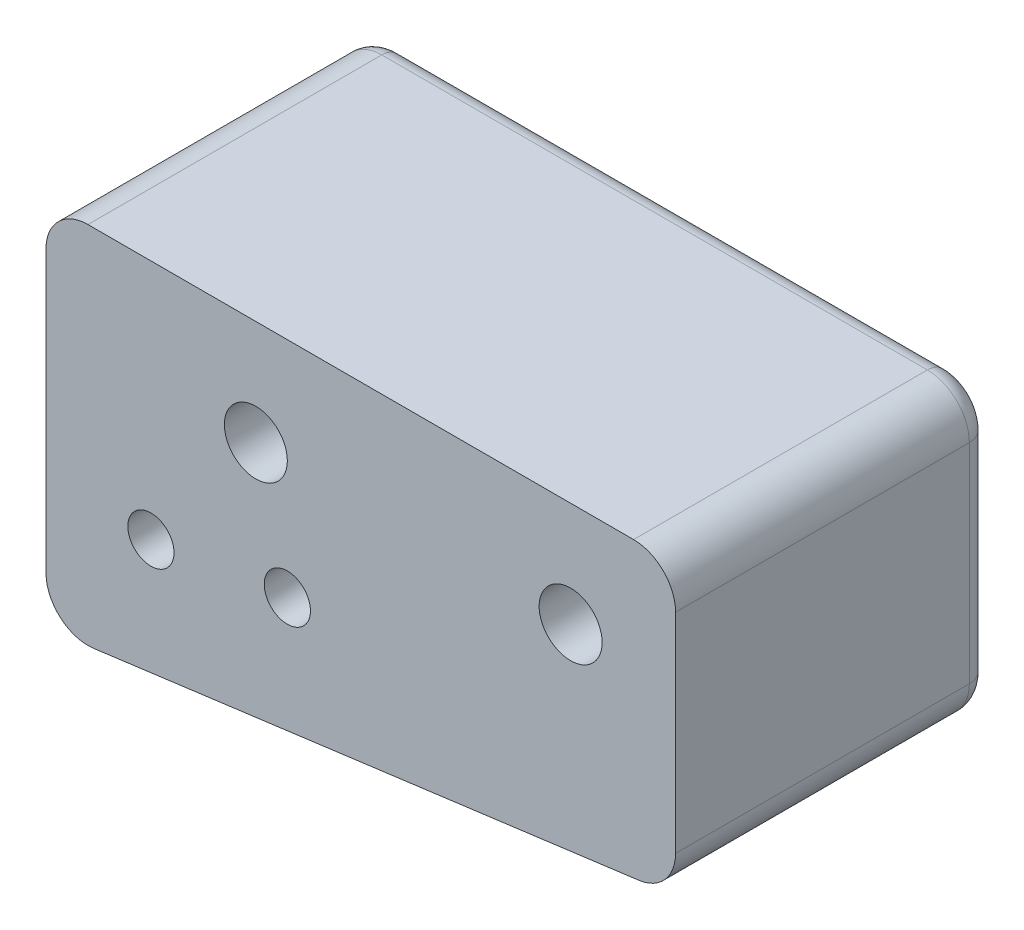
ISO-10303-21;
HEADER;
FILE_DESCRIPTION(('STEP AP214'),'2;1');
FILE_NAME('part.step','',(''),(''),'','','');
FILE_SCHEMA(('AUTOMOTIVE_DESIGN { 1 0 10303 214 1 1 1 1 }'));
ENDSEC;
DATA;
#1=APPLICATION_CONTEXT('core data for automotive mechanical design processes');
#2=APPLICATION_PROTOCOL_DEFINITION('international standard','automotive_design',2000,#1);
#3=PRODUCT_CONTEXT('',#1,'mechanical');
#4=PRODUCT('Part','Part','',(#3));
#5=PRODUCT_RELATED_PRODUCT_CATEGORY('part','',(#4));
#6=PRODUCT_DEFINITION_FORMATION('','',#4);
#7=PRODUCT_DEFINITION_CONTEXT('part definition',#1,'design');
#8=PRODUCT_DEFINITION('design','',#6,#7);
#9=PRODUCT_DEFINITION_SHAPE('','',#8);
#10=(LENGTH_UNIT() NAMED_UNIT(*) SI_UNIT(.MILLI.,.METRE.));
#11=(NAMED_UNIT(*) PLANE_ANGLE_UNIT() SI_UNIT($,.RADIAN.));
#12=(NAMED_UNIT(*) SI_UNIT($,.STERADIAN.) SOLID_ANGLE_UNIT());
#13=UNCERTAINTY_MEASURE_WITH_UNIT(LENGTH_MEASURE(1.E-05),#10,'distance_accuracy_value','');
#14=(GEOMETRIC_REPRESENTATION_CONTEXT(3) GLOBAL_UNCERTAINTY_ASSIGNED_CONTEXT((#13)) GLOBAL_UNIT_ASSIGNED_CONTEXT((#10,
#11,#12)) REPRESENTATION_CONTEXT('',''));
#15=CARTESIAN_POINT('',(0.,0.,0.));
#16=DIRECTION('',(0.,0.,1.));
#17=DIRECTION('',(1.,0.,0.));
#18=AXIS2_PLACEMENT_3D('',#15,#16,#17);
#19=CARTESIAN_POINT('',(0.,0.,-15.));
#20=DIRECTION('',(0.,0.,1.));
#21=DIRECTION('',(-1.,0.,0.));
#22=AXIS2_PLACEMENT_3D('',#19,#20,#21);
#23=PLANE('',#22);
#24=DIRECTION('',(0.,-1.,0.));
#25=VECTOR('',#24,1.);
#26=CARTESIAN_POINT('',(1.,0.,-15.));
#27=LINE('',#26,#25);
#28=CARTESIAN_POINT('',(0.999999999999999,0.919280300178109,-15.));
#29=VERTEX_POINT('',#28);
#30=CARTESIAN_POINT('',(1.,-5.37390181447922,-15.));
#31=VERTEX_POINT('',#30);
#32=EDGE_CURVE('E306',#29,#31,#27,.T.);
#33=ORIENTED_EDGE('',*,*,#32,.F.);
#34=DIRECTION('',(0.130526192220053,-0.99144486137381,0.));
#35=VECTOR('',#34,1.);
#36=CARTESIAN_POINT('',(1.96307764153026,-6.39602065634889,-15.));
#37=LINE('',#36,#35);
#38=CARTESIAN_POINT('',(1.96006059571014,-6.37310391815243,-15.));
#39=VERTEX_POINT('',#38);
#40=EDGE_CURVE('E441',#29,#39,#37,.T.);
#41=ORIENTED_EDGE('',*,*,#40,.T.);
#42=CARTESIAN_POINT('',(2.,-5.37390181447922,-15.));
#43=DIRECTION('',(0.,0.,-1.));
#44=DIRECTION('',(-1.,0.,0.));
#45=AXIS2_PLACEMENT_3D('',#42,#43,#44);
#46=CIRCLE('',#45,1.);
#47=EDGE_CURVE('E309',#31,#39,#46,.F.);
#48=ORIENTED_EDGE('',*,*,#47,.F.);
#49=EDGE_LOOP('',(#33,#41,#48));
#50=FACE_BOUND('',#49,.T.);
#51=ADVANCED_FACE('F43',(#50),#23,.F.);
#52=DIRECTION('',(-0.130526192220053,0.99144486137381,0.));
#53=VECTOR('',#52,1.);
#54=CARTESIAN_POINT('',(14.541060574064,3.79062029652878,-15.));
#55=LINE('',#54,#53);
#56=CARTESIAN_POINT('',(15.6439000588201,-4.58627725548289,-15.));
#57=VERTEX_POINT('',#56);
#58=CARTESIAN_POINT('',(14.541060574064,3.79062029652878,-15.));
#59=VERTEX_POINT('',#58);
#60=EDGE_CURVE('E195',#57,#59,#55,.T.);
#61=ORIENTED_EDGE('',*,*,#60,.T.);
#62=DIRECTION('',(-0.99144486137381,-0.130526192220053,0.));
#63=VECTOR('',#62,1.);
#64=CARTESIAN_POINT('',(0.859121487105373,1.98935884389205,-15.));
#65=LINE('',#64,#63);
#66=CARTESIAN_POINT('',(1.,2.00790585197102,-15.));
#67=VERTEX_POINT('',#66);
#68=EDGE_CURVE('E445',#59,#67,#65,.T.);
#69=ORIENTED_EDGE('',*,*,#68,.T.);
#70=DIRECTION('',(0.,-1.,0.));
#71=VECTOR('',#70,1.);
#72=CARTESIAN_POINT('',(1.,0.,-15.));
#73=LINE('',#72,#71);
#74=CARTESIAN_POINT('',(1.,8.,-15.));
#75=VERTEX_POINT('',#74);
#76=EDGE_CURVE('E291',#75,#67,#73,.T.);
#77=ORIENTED_EDGE('',*,*,#76,.F.);
#78=CARTESIAN_POINT('',(2.,8.,-15.));
#79=DIRECTION('',(0.,0.,-1.));
#80=DIRECTION('',(-1.,0.,0.));
#81=AXIS2_PLACEMENT_3D('',#78,#79,#80);
#82=CIRCLE('',#81,1.);
#83=CARTESIAN_POINT('',(2.,9.,-15.));
#84=VERTEX_POINT('',#83);
#85=EDGE_CURVE('E289',#84,#75,#82,.F.);
#86=ORIENTED_EDGE('',*,*,#85,.F.);
#87=DIRECTION('',(-1.,0.,0.));
#88=VECTOR('',#87,1.);
#89=CARTESIAN_POINT('',(0.,9.,-15.));
#90=LINE('',#89,#88);
#91=CARTESIAN_POINT('',(28.,9.,-15.));
#92=VERTEX_POINT('',#91);
#93=EDGE_CURVE('E287',#92,#84,#90,.T.);
#94=ORIENTED_EDGE('',*,*,#93,.F.);
#95=CARTESIAN_POINT('',(28.,8.,-15.));
#96=DIRECTION('',(0.,0.,-1.));
#97=DIRECTION('',(-1.,0.,0.));
#98=AXIS2_PLACEMENT_3D('',#95,#96,#97);
#99=CIRCLE('',#98,1.);
#100=CARTESIAN_POINT('',(29.,8.,-15.));
#101=VERTEX_POINT('',#100);
#102=EDGE_CURVE('E294',#101,#92,#99,.F.);
#103=ORIENTED_EDGE('',*,*,#102,.F.);
#104=DIRECTION('',(0.,1.,0.));
#105=VECTOR('',#104,1.);
#106=CARTESIAN_POINT('',(29.,0.,-15.));
#107=LINE('',#106,#105);
#108=CARTESIAN_POINT('',(29.,-1.9509368772069,-15.));
#109=VERTEX_POINT('',#108);
#110=EDGE_CURVE('E297',#109,#101,#107,.T.);
#111=ORIENTED_EDGE('',*,*,#110,.F.);
#112=CARTESIAN_POINT('',(28.,-1.9509368772069,-15.));
#113=DIRECTION('',(0.,0.,-1.));
#114=DIRECTION('',(-1.,0.,0.));
#115=AXIS2_PLACEMENT_3D('',#112,#113,#114);
#116=CIRCLE('',#115,1.);
#117=CARTESIAN_POINT('',(28.1305261922201,-2.94238173858071,-15.));
#118=VERTEX_POINT('',#117);
#119=EDGE_CURVE('E300',#118,#109,#116,.F.);
#120=ORIENTED_EDGE('',*,*,#119,.F.);
#121=DIRECTION('',(0.99144486137381,0.130526192220053,0.));
#122=VECTOR('',#121,1.);
#123=CARTESIAN_POINT('',(28.13052619222,-2.94238173858071,-15.));
#124=LINE('',#123,#122);
#125=EDGE_CURVE('E303',#57,#118,#124,.T.);
#126=ORIENTED_EDGE('',*,*,#125,.F.);
#127=EDGE_LOOP('',(#61,#69,#77,#86,#94,#103,#111,#120,#126));
#128=FACE_BOUND('',#127,.T.);
#129=CARTESIAN_POINT('',(10.,5.,-15.));
#130=DIRECTION('',(0.,0.,1.));
#131=DIRECTION('',(1.,0.,0.));
#132=AXIS2_PLACEMENT_3D('',#129,#130,#131);
#133=CIRCLE('',#132,1.5);
#134=CARTESIAN_POINT('',(11.5,5.,-15.));
#135=VERTEX_POINT('',#134);
#136=EDGE_CURVE('E236',#135,#135,#133,.T.);
#137=ORIENTED_EDGE('',*,*,#136,.T.);
#138=EDGE_LOOP('',(#137));
#139=FACE_BOUND('',#138,.T.);
#140=CARTESIAN_POINT('',(25.,5.,-15.));
#141=DIRECTION('',(0.,0.,1.));
#142=DIRECTION('',(1.,0.,0.));
#143=AXIS2_PLACEMENT_3D('',#140,#141,#142);
#144=CIRCLE('',#143,1.5);
#145=CARTESIAN_POINT('',(26.5,5.,-15.));
#146=VERTEX_POINT('',#145);
#147=EDGE_CURVE('E230',#146,#146,#144,.T.);
#148=ORIENTED_EDGE('',*,*,#147,.T.);
#149=EDGE_LOOP('',(#148));
#150=FACE_BOUND('',#149,.T.);
#151=ADVANCED_FACE('F370',(#128,#139,#150),#23,.F.);
#152=CARTESIAN_POINT('',(0.,0.,0.));
#153=DIRECTION('',(0.,0.,1.));
#154=DIRECTION('',(-1.,0.,0.));
#155=AXIS2_PLACEMENT_3D('',#152,#153,#154);
#156=PLANE('',#155);
#157=CARTESIAN_POINT('',(5.,-1.5,0.));
#158=DIRECTION('',(0.,0.,1.));
#159=DIRECTION('',(1.,0.,0.));
#160=AXIS2_PLACEMENT_3D('',#157,#158,#159);
#161=CIRCLE('',#160,1.1);
#162=CARTESIAN_POINT('',(6.1,-1.5,0.));
#163=VERTEX_POINT('',#162);
#164=EDGE_CURVE('E221',#163,#163,#161,.T.);
#165=ORIENTED_EDGE('',*,*,#164,.F.);
#166=EDGE_LOOP('',(#165));
#167=FACE_BOUND('',#166,.T.);
#168=CARTESIAN_POINT('',(11.5,-0.644258765681919,0.));
#169=DIRECTION('',(0.,0.,1.));
#170=DIRECTION('',(1.,0.,0.));
#171=AXIS2_PLACEMENT_3D('',#168,#169,#170);
#172=CIRCLE('',#171,1.1);
#173=CARTESIAN_POINT('',(12.6,-0.644258765681919,0.));
#174=VERTEX_POINT('',#173);
#175=EDGE_CURVE('E220',#174,#174,#172,.T.);
#176=ORIENTED_EDGE('',*,*,#175,.F.);
#177=EDGE_LOOP('',(#176));
#178=FACE_BOUND('',#177,.T.);
#179=CARTESIAN_POINT('',(10.,5.,0.));
#180=DIRECTION('',(0.,0.,1.));
#181=DIRECTION('',(1.,0.,0.));
#182=AXIS2_PLACEMENT_3D('',#179,#180,#181);
#183=CIRCLE('',#182,1.5);
#184=CARTESIAN_POINT('',(11.5,5.,0.));
#185=VERTEX_POINT('',#184);
#186=EDGE_CURVE('E233',#185,#185,#183,.T.);
#187=ORIENTED_EDGE('',*,*,#186,.F.);
#188=EDGE_LOOP('',(#187));
#189=FACE_BOUND('',#188,.T.);
#190=DIRECTION('',(-1.,0.,0.));
#191=VECTOR('',#190,1.);
#192=CARTESIAN_POINT('',(0.,10.,0.));
#193=LINE('',#192,#191);
#194=CARTESIAN_POINT('',(28.,10.,0.));
#195=VERTEX_POINT('',#194);
#196=CARTESIAN_POINT('',(2.,10.,0.));
#197=VERTEX_POINT('',#196);
#198=EDGE_CURVE('E247',#195,#197,#193,.T.);
#199=ORIENTED_EDGE('',*,*,#198,.T.);
#200=CARTESIAN_POINT('',(2.,8.,0.));
#201=DIRECTION('',(0.,0.,-1.));
#202=DIRECTION('',(-1.,0.,0.));
#203=AXIS2_PLACEMENT_3D('',#200,#201,#202);
#204=CIRCLE('',#203,2.);
#205=CARTESIAN_POINT('',(0.,8.,0.));
#206=VERTEX_POINT('',#205);
#207=EDGE_CURVE('E263',#206,#197,#204,.T.);
#208=ORIENTED_EDGE('',*,*,#207,.F.);
#209=DIRECTION('',(0.,-1.,0.));
#210=VECTOR('',#209,1.);
#211=CARTESIAN_POINT('',(0.,0.,0.));
#212=LINE('',#211,#210);
#213=CARTESIAN_POINT('',(0.,-5.37390181447922,0.));
#214=VERTEX_POINT('',#213);
#215=EDGE_CURVE('E239',#206,#214,#212,.T.);
#216=ORIENTED_EDGE('',*,*,#215,.T.);
#217=CARTESIAN_POINT('',(2.,-5.37390181447922,0.));
#218=DIRECTION('',(0.,0.,-1.));
#219=DIRECTION('',(-1.,0.,0.));
#220=AXIS2_PLACEMENT_3D('',#217,#218,#219);
#221=CIRCLE('',#220,2.);
#222=CARTESIAN_POINT('',(2.2610523844401,-7.35679153722684,0.));
#223=VERTEX_POINT('',#222);
#224=EDGE_CURVE('E260',#223,#214,#221,.T.);
#225=ORIENTED_EDGE('',*,*,#224,.F.);
#226=DIRECTION('',(0.99144486137381,0.130526192220053,0.));
#227=VECTOR('',#226,1.);
#228=CARTESIAN_POINT('',(30.,-3.70488980319241,0.));
#229=LINE('',#228,#227);
#230=CARTESIAN_POINT('',(28.2610523844401,-3.93382659995452,0.));
#231=VERTEX_POINT('',#230);
#232=EDGE_CURVE('E224',#223,#231,#229,.T.);
#233=ORIENTED_EDGE('',*,*,#232,.T.);
#234=CARTESIAN_POINT('',(28.,-1.9509368772069,0.));
#235=DIRECTION('',(0.,0.,-1.));
#236=DIRECTION('',(-1.,0.,0.));
#237=AXIS2_PLACEMENT_3D('',#234,#235,#236);
#238=CIRCLE('',#237,2.);
#239=CARTESIAN_POINT('',(30.,-1.9509368772069,0.));
#240=VERTEX_POINT('',#239);
#241=EDGE_CURVE('E257',#240,#231,#238,.T.);
#242=ORIENTED_EDGE('',*,*,#241,.F.);
#243=DIRECTION('',(0.,1.,0.));
#244=VECTOR('',#243,1.);
#245=CARTESIAN_POINT('',(30.,0.,0.));
#246=LINE('',#245,#244);
#247=CARTESIAN_POINT('',(30.,8.,0.));
#248=VERTEX_POINT('',#247);
#249=EDGE_CURVE('E244',#240,#248,#246,.T.);
#250=ORIENTED_EDGE('',*,*,#249,.T.);
#251=CARTESIAN_POINT('',(28.,8.,0.));
#252=DIRECTION('',(0.,0.,-1.));
#253=DIRECTION('',(-1.,0.,0.));
#254=AXIS2_PLACEMENT_3D('',#251,#252,#253);
#255=CIRCLE('',#254,2.);
#256=EDGE_CURVE('E266',#195,#248,#255,.T.);
#257=ORIENTED_EDGE('',*,*,#256,.F.);
#258=EDGE_LOOP('',(#199,#208,#216,#225,#233,#242,#250,#257));
#259=FACE_BOUND('',#258,.T.);
#260=CARTESIAN_POINT('',(25.,5.,0.));
#261=DIRECTION('',(0.,0.,1.));
#262=DIRECTION('',(1.,0.,0.));
#263=AXIS2_PLACEMENT_3D('',#260,#261,#262);
#264=CIRCLE('',#263,1.5);
#265=CARTESIAN_POINT('',(26.5,5.,0.));
#266=VERTEX_POINT('',#265);
#267=EDGE_CURVE('E229',#266,#266,#264,.T.);
#268=ORIENTED_EDGE('',*,*,#267,.F.);
#269=EDGE_LOOP('',(#268));
#270=FACE_BOUND('',#269,.T.);
#271=ADVANCED_FACE('F373',(#167,#178,#189,#259,#270),#156,.T.);
#272=CARTESIAN_POINT('',(0.,0.,-15.));
#273=DIRECTION('',(1.,0.,0.));
#274=DIRECTION('',(0.,0.,1.));
#275=AXIS2_PLACEMENT_3D('',#272,#273,#274);
#276=PLANE('',#275);
#277=DIRECTION('',(0.,0.,-1.));
#278=VECTOR('',#277,1.);
#279=CARTESIAN_POINT('',(0.,-5.37390181447922,-7.));
#280=LINE('',#279,#278);
#281=CARTESIAN_POINT('',(0.,-5.37390181447922,-14.));
#282=VERTEX_POINT('',#281);
#283=EDGE_CURVE('E274',#214,#282,#280,.T.);
#284=ORIENTED_EDGE('',*,*,#283,.F.);
#285=ORIENTED_EDGE('',*,*,#215,.F.);
#286=DIRECTION('',(0.,0.,1.));
#287=VECTOR('',#286,1.);
#288=CARTESIAN_POINT('',(0.,8.,-15.));
#289=LINE('',#288,#287);
#290=CARTESIAN_POINT('',(0.,8.,-14.));
#291=VERTEX_POINT('',#290);
#292=EDGE_CURVE('E277',#291,#206,#289,.T.);
#293=ORIENTED_EDGE('',*,*,#292,.F.);
#294=DIRECTION('',(0.,-1.,0.));
#295=VECTOR('',#294,1.);
#296=CARTESIAN_POINT('',(0.,0.,-14.));
#297=LINE('',#296,#295);
#298=EDGE_CURVE('E480',#282,#291,#297,.F.);
#299=ORIENTED_EDGE('',*,*,#298,.F.);
#300=EDGE_LOOP('',(#284,#285,#293,#299));
#301=FACE_BOUND('',#300,.T.);
#302=ADVANCED_FACE('F377',(#301),#276,.F.);
#303=CARTESIAN_POINT('',(30.,0.,-15.));
#304=DIRECTION('',(-1.,0.,0.));
#305=DIRECTION('',(0.,0.,-1.));
#306=AXIS2_PLACEMENT_3D('',#303,#304,#305);
#307=PLANE('',#306);
#308=DIRECTION('',(0.,0.,1.));
#309=VECTOR('',#308,1.);
#310=CARTESIAN_POINT('',(30.,8.,-15.));
#311=LINE('',#310,#309);
#312=CARTESIAN_POINT('',(30.,8.,-14.));
#313=VERTEX_POINT('',#312);
#314=EDGE_CURVE('E271',#248,#313,#311,.F.);
#315=ORIENTED_EDGE('',*,*,#314,.F.);
#316=ORIENTED_EDGE('',*,*,#249,.F.);
#317=DIRECTION('',(0.,0.,-1.));
#318=VECTOR('',#317,1.);
#319=CARTESIAN_POINT('',(30.,-1.9509368772069,0.));
#320=LINE('',#319,#318);
#321=CARTESIAN_POINT('',(30.,-1.9509368772069,-14.));
#322=VERTEX_POINT('',#321);
#323=EDGE_CURVE('E269',#322,#240,#320,.F.);
#324=ORIENTED_EDGE('',*,*,#323,.F.);
#325=DIRECTION('',(0.,1.,0.));
#326=VECTOR('',#325,1.);
#327=CARTESIAN_POINT('',(30.,0.,-14.));
#328=LINE('',#327,#326);
#329=EDGE_CURVE('E320',#313,#322,#328,.F.);
#330=ORIENTED_EDGE('',*,*,#329,.F.);
#331=EDGE_LOOP('',(#315,#316,#324,#330));
#332=FACE_BOUND('',#331,.T.);
#333=ADVANCED_FACE('F381',(#332),#307,.F.);
#334=CARTESIAN_POINT('',(0.,10.,-15.));
#335=DIRECTION('',(0.,-1.,0.));
#336=DIRECTION('',(1.,0.,0.));
#337=AXIS2_PLACEMENT_3D('',#334,#335,#336);
#338=PLANE('',#337);
#339=DIRECTION('',(0.,0.,1.));
#340=VECTOR('',#339,1.);
#341=CARTESIAN_POINT('',(2.,10.,-15.));
#342=LINE('',#341,#340);
#343=CARTESIAN_POINT('',(2.,10.,-14.));
#344=VERTEX_POINT('',#343);
#345=EDGE_CURVE('E250',#197,#344,#342,.F.);
#346=ORIENTED_EDGE('',*,*,#345,.F.);
#347=ORIENTED_EDGE('',*,*,#198,.F.);
#348=DIRECTION('',(0.,0.,1.));
#349=VECTOR('',#348,1.);
#350=CARTESIAN_POINT('',(28.,10.,-15.));
#351=LINE('',#350,#349);
#352=CARTESIAN_POINT('',(28.,10.,-14.));
#353=VERTEX_POINT('',#352);
#354=EDGE_CURVE('E255',#353,#195,#351,.T.);
#355=ORIENTED_EDGE('',*,*,#354,.F.);
#356=DIRECTION('',(-1.,0.,0.));
#357=VECTOR('',#356,1.);
#358=CARTESIAN_POINT('',(0.,10.,-14.));
#359=LINE('',#358,#357);
#360=EDGE_CURVE('E12',#344,#353,#359,.F.);
#361=ORIENTED_EDGE('',*,*,#360,.F.);
#362=EDGE_LOOP('',(#346,#347,#355,#361));
#363=FACE_BOUND('',#362,.T.);
#364=ADVANCED_FACE('F368',(#363),#338,.F.);
#365=CARTESIAN_POINT('',(10.,5.,-15.));
#366=DIRECTION('',(0.,0.,1.));
#367=DIRECTION('',(-1.,0.,0.));
#368=AXIS2_PLACEMENT_3D('',#365,#366,#367);
#369=CYLINDRICAL_SURFACE('',#368,1.5);
#370=ORIENTED_EDGE('',*,*,#136,.F.);
#371=EDGE_LOOP('',(#370));
#372=FACE_BOUND('',#371,.T.);
#373=ORIENTED_EDGE('',*,*,#186,.T.);
#374=EDGE_LOOP('',(#373));
#375=FACE_BOUND('',#374,.T.);
#376=ADVANCED_FACE('F364',(#372,#375),#369,.F.);
#377=CARTESIAN_POINT('',(25.,5.,-15.));
#378=DIRECTION('',(0.,0.,1.));
#379=DIRECTION('',(-1.,0.,0.));
#380=AXIS2_PLACEMENT_3D('',#377,#378,#379);
#381=CYLINDRICAL_SURFACE('',#380,1.5);
#382=ORIENTED_EDGE('',*,*,#147,.F.);
#383=EDGE_LOOP('',(#382));
#384=FACE_BOUND('',#383,.T.);
#385=ORIENTED_EDGE('',*,*,#267,.T.);
#386=EDGE_LOOP('',(#385));
#387=FACE_BOUND('',#386,.T.);
#388=ADVANCED_FACE('F360',(#384,#387),#381,.F.);
#389=CARTESIAN_POINT('',(30.,-3.70488980319241,0.));
#390=DIRECTION('',(0.130526192220053,-0.99144486137381,0.));
#391=DIRECTION('',(0.99144486137381,0.130526192220053,0.));
#392=AXIS2_PLACEMENT_3D('',#389,#390,#391);
#393=PLANE('',#392);
#394=DIRECTION('',(0.,0.,-1.));
#395=VECTOR('',#394,1.);
#396=CARTESIAN_POINT('',(28.2610523844401,-3.93382659995452,-15.));
#397=LINE('',#396,#395);
#398=CARTESIAN_POINT('',(28.2610523844401,-3.93382659995452,-14.));
#399=VERTEX_POINT('',#398);
#400=EDGE_CURVE('E282',#231,#399,#397,.T.);
#401=ORIENTED_EDGE('',*,*,#400,.F.);
#402=ORIENTED_EDGE('',*,*,#232,.F.);
#403=DIRECTION('',(0.,0.,-1.));
#404=VECTOR('',#403,1.);
#405=CARTESIAN_POINT('',(2.2610523844401,-7.35679153722684,0.));
#406=LINE('',#405,#404);
#407=CARTESIAN_POINT('',(2.2610523844401,-7.35679153722684,-7.));
#408=VERTEX_POINT('',#407);
#409=EDGE_CURVE('E285',#408,#223,#406,.F.);
#410=ORIENTED_EDGE('',*,*,#409,.F.);
#411=DIRECTION('',(0.99144486137381,0.130526192220053,0.));
#412=VECTOR('',#411,1.);
#413=CARTESIAN_POINT('',(15.7744262510401,-5.57772211685669,-7.));
#414=LINE('',#413,#412);
#415=CARTESIAN_POINT('',(15.7744262510401,-5.57772211685669,-7.));
#416=VERTEX_POINT('',#415);
#417=EDGE_CURVE('E202',#408,#416,#414,.T.);
#418=ORIENTED_EDGE('',*,*,#417,.T.);
#419=DIRECTION('',(0.,0.,-1.));
#420=VECTOR('',#419,1.);
#421=CARTESIAN_POINT('',(15.7744262510401,-5.57772211685669,19.489035246328));
#422=LINE('',#421,#420);
#423=CARTESIAN_POINT('',(15.7744262510401,-5.57772211685669,-14.));
#424=VERTEX_POINT('',#423);
#425=EDGE_CURVE('E205',#416,#424,#422,.T.);
#426=ORIENTED_EDGE('',*,*,#425,.T.);
#427=DIRECTION('',(0.99144486137381,0.130526192220053,0.));
#428=VECTOR('',#427,1.);
#429=CARTESIAN_POINT('',(15.7744262510401,-5.57772211685669,-14.));
#430=LINE('',#429,#428);
#431=EDGE_CURVE('E312',#399,#424,#430,.F.);
#432=ORIENTED_EDGE('',*,*,#431,.F.);
#433=EDGE_LOOP('',(#401,#402,#410,#418,#426,#432));
#434=FACE_BOUND('',#433,.T.);
#435=ADVANCED_FACE('F356',(#434),#393,.T.);
#436=CARTESIAN_POINT('',(11.5,-0.644258765681919,0.));
#437=DIRECTION('',(0.,0.,-1.));
#438=DIRECTION('',(1.,0.,0.));
#439=AXIS2_PLACEMENT_3D('',#436,#437,#438);
#440=CYLINDRICAL_SURFACE('',#439,1.1);
#441=CARTESIAN_POINT('',(11.5,-0.644258765681919,-7.));
#442=DIRECTION('',(0.,0.,-1.));
#443=DIRECTION('',(-1.,0.,0.));
#444=AXIS2_PLACEMENT_3D('',#441,#442,#443);
#445=CIRCLE('',#444,1.1);
#446=CARTESIAN_POINT('',(10.4,-0.644258765681919,-7.));
#447=VERTEX_POINT('',#446);
#448=EDGE_CURVE('E217',#447,#447,#445,.F.);
#449=ORIENTED_EDGE('',*,*,#448,.F.);
#450=EDGE_LOOP('',(#449));
#451=FACE_BOUND('',#450,.T.);
#452=ORIENTED_EDGE('',*,*,#175,.T.);
#453=EDGE_LOOP('',(#452));
#454=FACE_BOUND('',#453,.T.);
#455=ADVANCED_FACE('F352',(#451,#454),#440,.F.);
#456=CARTESIAN_POINT('',(5.,-1.5,0.));
#457=DIRECTION('',(0.,0.,-1.));
#458=DIRECTION('',(1.,0.,0.));
#459=AXIS2_PLACEMENT_3D('',#456,#457,#458);
#460=CYLINDRICAL_SURFACE('',#459,1.1);
#461=CARTESIAN_POINT('',(5.,-1.5,-7.));
#462=DIRECTION('',(0.,0.,-1.));
#463=DIRECTION('',(-1.,0.,0.));
#464=AXIS2_PLACEMENT_3D('',#461,#462,#463);
#465=CIRCLE('',#464,1.1);
#466=CARTESIAN_POINT('',(3.9,-1.5,-7.));
#467=VERTEX_POINT('',#466);
#468=EDGE_CURVE('E216',#467,#467,#465,.F.);
#469=ORIENTED_EDGE('',*,*,#468,.F.);
#470=EDGE_LOOP('',(#469));
#471=FACE_BOUND('',#470,.T.);
#472=ORIENTED_EDGE('',*,*,#164,.T.);
#473=EDGE_LOOP('',(#472));
#474=FACE_BOUND('',#473,.T.);
#475=ADVANCED_FACE('F348',(#471,#474),#460,.F.);
#476=CARTESIAN_POINT('',(0.,0.,-7.));
#477=DIRECTION('',(0.,0.,1.));
#478=DIRECTION('',(-1.,0.,0.));
#479=AXIS2_PLACEMENT_3D('',#476,#477,#478);
#480=PLANE('',#479);
#481=ORIENTED_EDGE('',*,*,#468,.T.);
#482=EDGE_LOOP('',(#481));
#483=FACE_BOUND('',#482,.T.);
#484=DIRECTION('',(-0.99144486137381,-0.130526192220053,0.));
#485=VECTOR('',#484,1.);
#486=CARTESIAN_POINT('',(0.,-6.65446473081432,-7.));
#487=LINE('',#486,#485);
#488=CARTESIAN_POINT('',(1.96307764153026,-6.39602065634889,-7.));
#489=VERTEX_POINT('',#488);
#490=CARTESIAN_POINT('',(0.419335054275059,-6.59925822359306,-7.));
#491=VERTEX_POINT('',#490);
#492=EDGE_CURVE('E179',#489,#491,#487,.T.);
#493=ORIENTED_EDGE('',*,*,#492,.F.);
#494=DIRECTION('',(0.130526192220053,-0.99144486137381,0.));
#495=VECTOR('',#494,1.);
#496=CARTESIAN_POINT('',(1.96307764153026,-6.39602065634889,-7.));
#497=LINE('',#496,#495);
#498=CARTESIAN_POINT('',(0.859121487105373,1.98935884389204,-7.));
#499=VERTEX_POINT('',#498);
#500=EDGE_CURVE('E184',#499,#489,#497,.T.);
#501=ORIENTED_EDGE('',*,*,#500,.F.);
#502=DIRECTION('',(-0.99144486137381,-0.130526192220053,0.));
#503=VECTOR('',#502,1.);
#504=CARTESIAN_POINT('',(0.859121487105373,1.98935884389205,-7.));
#505=LINE('',#504,#503);
#506=CARTESIAN_POINT('',(14.541060574064,3.79062029652878,-7.));
#507=VERTEX_POINT('',#506);
#508=EDGE_CURVE('E211',#507,#499,#505,.T.);
#509=ORIENTED_EDGE('',*,*,#508,.F.);
#510=DIRECTION('',(-0.130526192220053,0.99144486137381,0.));
#511=VECTOR('',#510,1.);
#512=CARTESIAN_POINT('',(14.541060574064,3.79062029652878,-7.));
#513=LINE('',#512,#511);
#514=EDGE_CURVE('E212',#416,#507,#513,.T.);
#515=ORIENTED_EDGE('',*,*,#514,.F.);
#516=ORIENTED_EDGE('',*,*,#417,.F.);
#517=CARTESIAN_POINT('',(2.,-5.37390181447922,-7.));
#518=DIRECTION('',(0.,0.,-1.));
#519=DIRECTION('',(-1.,0.,0.));
#520=AXIS2_PLACEMENT_3D('',#517,#518,#519);
#521=CIRCLE('',#520,2.);
#522=EDGE_CURVE('E201',#491,#408,#521,.F.);
#523=ORIENTED_EDGE('',*,*,#522,.F.);
#524=EDGE_LOOP('',(#493,#501,#509,#515,#516,#523));
#525=FACE_BOUND('',#524,.T.);
#526=ORIENTED_EDGE('',*,*,#448,.T.);
#527=EDGE_LOOP('',(#526));
#528=FACE_BOUND('',#527,.T.);
#529=ADVANCED_FACE('F198',(#483,#525,#528),#480,.F.);
#530=CARTESIAN_POINT('',(1.96307764153026,-6.39602065634889,19.489035246328));
#531=DIRECTION('',(-0.99144486137381,-0.130526192220053,0.));
#532=DIRECTION('',(0.130526192220053,-0.99144486137381,0.));
#533=AXIS2_PLACEMENT_3D('',#530,#531,#532);
#534=PLANE('',#533);
#535=ORIENTED_EDGE('',*,*,#40,.F.);
#536=CARTESIAN_POINT('',(1.,0.919280300178094,-14.));
#537=DIRECTION('',(0.99144486137381,0.130526192220053,0.));
#538=DIRECTION('',(0.130526192220053,-0.99144486137381,0.));
#539=AXIS2_PLACEMENT_3D('',#536,#537,#538);
#540=ELLIPSE('',#539,7.66129757554029,1.);
#541=CARTESIAN_POINT('',(0.859121487105373,1.98935884389205,-14.9900268908492));
#542=VERTEX_POINT('',#541);
#543=EDGE_CURVE('E326',#542,#29,#540,.F.);
#544=ORIENTED_EDGE('',*,*,#543,.F.);
#545=DIRECTION('',(0.,0.,-1.));
#546=VECTOR('',#545,1.);
#547=CARTESIAN_POINT('',(0.859121487105373,1.98935884389205,19.489035246328));
#548=LINE('',#547,#546);
#549=EDGE_CURVE('E191',#499,#542,#548,.T.);
#550=ORIENTED_EDGE('',*,*,#549,.F.);
#551=ORIENTED_EDGE('',*,*,#500,.T.);
#552=DIRECTION('',(0.,0.,-1.));
#553=VECTOR('',#552,1.);
#554=CARTESIAN_POINT('',(1.96307764153026,-6.39602065634889,19.489035246328));
#555=LINE('',#554,#553);
#556=CARTESIAN_POINT('',(1.96307764153026,-6.39602065634889,-14.9997403766986));
#557=VERTEX_POINT('',#556);
#558=EDGE_CURVE('E174',#489,#557,#555,.T.);
#559=ORIENTED_EDGE('',*,*,#558,.T.);
#560=CARTESIAN_POINT('',(1.96006059571014,-6.37310391815243,-15.));
#561=CARTESIAN_POINT('',(1.96056350013197,-6.37692385648293,-15.0000000129279));
#562=CARTESIAN_POINT('',(1.96106637282534,-6.3807435538117,-14.9999783841172));
#563=CARTESIAN_POINT('',(1.96207205476538,-6.38838246654386,-14.9998918430176));
#564=CARTESIAN_POINT('',(1.96257486401206,-6.39220168194724,-14.9998269307279));
#565=CARTESIAN_POINT('',(1.96307764153026,-6.39602065634889,-14.9997403766986));
#566=B_SPLINE_CURVE_WITH_KNOTS('',3,(#560,#561,#562,#563,#564,#565),.UNSPECIFIED.,.F.,.F.,(4,2,
4),(0.,0.0115581541740672,0.0231163085843436),.UNSPECIFIED.);
#567=EDGE_CURVE('E328',#39,#557,#566,.T.);
#568=ORIENTED_EDGE('',*,*,#567,.F.);
#569=EDGE_LOOP('',(#535,#544,#550,#551,#559,#568));
#570=FACE_BOUND('',#569,.T.);
#571=ADVANCED_FACE('F188',(#570),#534,.F.);
#572=CARTESIAN_POINT('',(0.,-6.65446473081432,19.489035246328));
#573=DIRECTION('',(-0.130526192220053,0.99144486137381,0.));
#574=DIRECTION('',(-0.99144486137381,-0.130526192220053,0.));
#575=AXIS2_PLACEMENT_3D('',#572,#573,#574);
#576=PLANE('',#575);
#577=ORIENTED_EDGE('',*,*,#558,.F.);
#578=ORIENTED_EDGE('',*,*,#492,.T.);
#579=DIRECTION('',(0.,0.,1.));
#580=VECTOR('',#579,1.);
#581=CARTESIAN_POINT('',(0.419335054275059,-6.59925822359306,-15.));
#582=LINE('',#581,#580);
#583=CARTESIAN_POINT('',(0.419335054275059,-6.59925822359306,-14.));
#584=VERTEX_POINT('',#583);
#585=EDGE_CURVE('E279',#584,#491,#582,.T.);
#586=ORIENTED_EDGE('',*,*,#585,.F.);
#587=CARTESIAN_POINT('',(1.96307764153026,-6.39602065634889,-14.9997403766986));
#588=CARTESIAN_POINT('',(1.9327214636675,-6.40001712298172,-14.9996175539997));
#589=CARTESIAN_POINT('',(1.90236552765878,-6.40401355777388,-14.9994395644838));
#590=CARTESIAN_POINT('',(1.8416482396771,-6.4120071403834,-14.998795709833));
#591=CARTESIAN_POINT('',(1.81128688864219,-6.41600428807727,-14.9983297622834));
#592=CARTESIAN_POINT('',(1.71983298728622,-6.4280444226049,-14.9962248717763));
#593=CARTESIAN_POINT('',(1.65874969657991,-6.43608619038724,-14.9938759439646));
#594=CARTESIAN_POINT('',(1.53548905709447,-6.45231376142972,-14.985391958825));
#595=CARTESIAN_POINT('',(1.47331627273518,-6.46049896377258,-14.9791769454138));
#596=CARTESIAN_POINT('',(1.34992867252864,-6.47674324951109,-14.9609664114359));
#597=CARTESIAN_POINT('',(1.28871164549236,-6.48480262401529,-14.9489872810023));
#598=CARTESIAN_POINT('',(1.16720341532863,-6.50079948599377,-14.917375316014));
#599=CARTESIAN_POINT('',(1.10693953641589,-6.50873337616693,-14.8976312636292));
#600=CARTESIAN_POINT('',(0.990237102346282,-6.52409754308673,-14.8494154057324));
#601=CARTESIAN_POINT('',(0.933780020154309,-6.5315302589638,-14.8209902594936));
#602=CARTESIAN_POINT('',(0.825792154500873,-6.5457471311862,-14.7544851292608));
#603=CARTESIAN_POINT('',(0.774324311667854,-6.55252300124061,-14.71629958157));
#604=CARTESIAN_POINT('',(0.679402630835043,-6.56501967759744,-14.6306876584911));
#605=CARTESIAN_POINT('',(0.635955522476537,-6.57073959792579,-14.583253591299));
#606=CARTESIAN_POINT('',(0.563549184330488,-6.58027207318387,-14.4858523941444));
#607=CARTESIAN_POINT('',(0.533548091146192,-6.58422179203194,-14.4366733596932));
#608=CARTESIAN_POINT('',(0.483420546663927,-6.59082120846095,-14.3334717254229));
#609=CARTESIAN_POINT('',(0.46327833621672,-6.59347298077326,-14.2794570198871));
#610=CARTESIAN_POINT('',(0.438902242243405,-6.59668215442627,-14.1875236551436));
#611=CARTESIAN_POINT('',(0.431584470821631,-6.59764555731072,-14.1504096822534));
#612=CARTESIAN_POINT('',(0.421794466420965,-6.59893443584146,-14.075539709786));
#613=CARTESIAN_POINT('',(0.419322045394517,-6.59925993624468,-14.0377837351823));
#614=CARTESIAN_POINT('',(0.419335054275059,-6.59925822359306,-14.));
#615=B_SPLINE_CURVE_WITH_KNOTS('',3,(#587,#588,#589,#590,#591,#592,#593,#594,#595,#596,#597,
#598,#599,#600,#601,#602,#603,#604,#605,#606,#607,#608,#609,#610,#611,#612,#613,#614),
.UNSPECIFIED.,.F.,.F.,(4,2,2,2,2,2,2,2,2,2,2,2,2,4),(0.,0.0918543312632958,0.183734963744142,
0.36864315333761,0.557508810985686,0.7458405788861,0.936974286414679,1.12709824536106,
1.31937258045334,1.51180751357633,1.68404966833066,1.85601559227379,1.96923721684901,
2.08245444721742),.UNSPECIFIED.);
#616=EDGE_CURVE('E181',#557,#584,#615,.T.);
#617=ORIENTED_EDGE('',*,*,#616,.F.);
#618=EDGE_LOOP('',(#577,#578,#586,#617));
#619=FACE_BOUND('',#618,.T.);
#620=ADVANCED_FACE('F176',(#619),#576,.F.);
#621=CARTESIAN_POINT('',(14.541060574064,3.79062029652878,19.489035246328));
#622=DIRECTION('',(0.99144486137381,0.130526192220053,0.));
#623=DIRECTION('',(-0.130526192220053,0.99144486137381,0.));
#624=AXIS2_PLACEMENT_3D('',#621,#622,#623);
#625=PLANE('',#624);
#626=ORIENTED_EDGE('',*,*,#425,.F.);
#627=ORIENTED_EDGE('',*,*,#514,.T.);
#628=DIRECTION('',(0.,0.,-1.));
#629=VECTOR('',#628,1.);
#630=CARTESIAN_POINT('',(14.541060574064,3.79062029652878,19.489035246328));
#631=LINE('',#630,#629);
#632=EDGE_CURVE('E209',#507,#59,#631,.T.);
#633=ORIENTED_EDGE('',*,*,#632,.T.);
#634=ORIENTED_EDGE('',*,*,#60,.F.);
#635=CARTESIAN_POINT('',(15.6439000588201,-4.58627725548288,-14.));
#636=DIRECTION('',(-0.99144486137381,-0.130526192220053,0.));
#637=DIRECTION('',(-0.130526192220053,0.99144486137381,0.));
#638=AXIS2_PLACEMENT_3D('',#635,#636,#637);
#639=CIRCLE('',#638,1.);
#640=EDGE_CURVE('E315',#424,#57,#639,.F.);
#641=ORIENTED_EDGE('',*,*,#640,.F.);
#642=EDGE_LOOP('',(#626,#627,#633,#634,#641));
#643=FACE_BOUND('',#642,.T.);
#644=ADVANCED_FACE('F455',(#643),#625,.F.);
#645=CARTESIAN_POINT('',(0.859121487105373,1.98935884389205,19.489035246328));
#646=DIRECTION('',(-0.130526192220053,0.99144486137381,0.));
#647=DIRECTION('',(-0.99144486137381,-0.130526192220053,0.));
#648=AXIS2_PLACEMENT_3D('',#645,#646,#647);
#649=PLANE('',#648);
#650=ORIENTED_EDGE('',*,*,#68,.F.);
#651=ORIENTED_EDGE('',*,*,#632,.F.);
#652=ORIENTED_EDGE('',*,*,#508,.T.);
#653=ORIENTED_EDGE('',*,*,#549,.T.);
#654=CARTESIAN_POINT('',(1.,2.00790585197102,-14.));
#655=DIRECTION('',(0.130526192220053,-0.99144486137381,0.));
#656=DIRECTION('',(-0.99144486137381,-0.130526192220053,0.));
#657=AXIS2_PLACEMENT_3D('',#654,#655,#656);
#658=ELLIPSE('',#657,1.00862896058015,1.);
#659=EDGE_CURVE('E444',#67,#542,#658,.F.);
#660=ORIENTED_EDGE('',*,*,#659,.F.);
#661=EDGE_LOOP('',(#650,#651,#652,#653,#660));
#662=FACE_BOUND('',#661,.T.);
#663=ADVANCED_FACE('F393',(#662),#649,.F.);
#664=CARTESIAN_POINT('',(28.,8.,-15.));
#665=DIRECTION('',(0.,0.,1.));
#666=DIRECTION('',(-1.,0.,0.));
#667=AXIS2_PLACEMENT_3D('',#664,#665,#666);
#668=CYLINDRICAL_SURFACE('',#667,2.);
#669=ORIENTED_EDGE('',*,*,#354,.T.);
#670=ORIENTED_EDGE('',*,*,#256,.T.);
#671=ORIENTED_EDGE('',*,*,#314,.T.);
#672=CARTESIAN_POINT('',(28.,8.,-14.));
#673=DIRECTION('',(0.,0.,-1.));
#674=DIRECTION('',(-1.,0.,0.));
#675=AXIS2_PLACEMENT_3D('',#672,#673,#674);
#676=CIRCLE('',#675,2.);
#677=EDGE_CURVE('E323',#353,#313,#676,.T.);
#678=ORIENTED_EDGE('',*,*,#677,.F.);
#679=EDGE_LOOP('',(#669,#670,#671,#678));
#680=FACE_BOUND('',#679,.T.);
#681=ADVANCED_FACE('F389',(#680),#668,.T.);
#682=CARTESIAN_POINT('',(2.,8.,-15.));
#683=DIRECTION('',(0.,0.,1.));
#684=DIRECTION('',(-1.,0.,0.));
#685=AXIS2_PLACEMENT_3D('',#682,#683,#684);
#686=CYLINDRICAL_SURFACE('',#685,2.);
#687=ORIENTED_EDGE('',*,*,#292,.T.);
#688=ORIENTED_EDGE('',*,*,#207,.T.);
#689=ORIENTED_EDGE('',*,*,#345,.T.);
#690=CARTESIAN_POINT('',(2.,8.,-14.));
#691=DIRECTION('',(0.,0.,-1.));
#692=DIRECTION('',(-1.,0.,0.));
#693=AXIS2_PLACEMENT_3D('',#690,#691,#692);
#694=CIRCLE('',#693,2.);
#695=EDGE_CURVE('E53',#291,#344,#694,.T.);
#696=ORIENTED_EDGE('',*,*,#695,.F.);
#697=EDGE_LOOP('',(#687,#688,#689,#696));
#698=FACE_BOUND('',#697,.T.);
#699=ADVANCED_FACE('F392',(#698),#686,.T.);
#700=CARTESIAN_POINT('',(2.,-5.37390181447922,-15.));
#701=DIRECTION('',(0.,0.,1.));
#702=DIRECTION('',(-1.,0.,0.));
#703=AXIS2_PLACEMENT_3D('',#700,#701,#702);
#704=CYLINDRICAL_SURFACE('',#703,2.);
#705=ORIENTED_EDGE('',*,*,#585,.T.);
#706=ORIENTED_EDGE('',*,*,#522,.T.);
#707=ORIENTED_EDGE('',*,*,#409,.T.);
#708=ORIENTED_EDGE('',*,*,#224,.T.);
#709=ORIENTED_EDGE('',*,*,#283,.T.);
#710=CARTESIAN_POINT('',(2.,-5.37390181447922,-14.));
#711=DIRECTION('',(0.,0.,-1.));
#712=DIRECTION('',(-1.,0.,0.));
#713=AXIS2_PLACEMENT_3D('',#710,#711,#712);
#714=CIRCLE('',#713,2.);
#715=EDGE_CURVE('E468',#584,#282,#714,.T.);
#716=ORIENTED_EDGE('',*,*,#715,.F.);
#717=EDGE_LOOP('',(#705,#706,#707,#708,#709,#716));
#718=FACE_BOUND('',#717,.T.);
#719=ADVANCED_FACE('F397',(#718),#704,.T.);
#720=CARTESIAN_POINT('',(28.,-1.9509368772069,0.));
#721=DIRECTION('',(0.,0.,1.));
#722=DIRECTION('',(-1.,0.,0.));
#723=AXIS2_PLACEMENT_3D('',#720,#721,#722);
#724=CYLINDRICAL_SURFACE('',#723,2.);
#725=ORIENTED_EDGE('',*,*,#323,.T.);
#726=ORIENTED_EDGE('',*,*,#241,.T.);
#727=ORIENTED_EDGE('',*,*,#400,.T.);
#728=CARTESIAN_POINT('',(28.,-1.9509368772069,-14.));
#729=DIRECTION('',(0.,0.,-1.));
#730=DIRECTION('',(-1.,0.,0.));
#731=AXIS2_PLACEMENT_3D('',#728,#729,#730);
#732=CIRCLE('',#731,2.);
#733=EDGE_CURVE('E317',#322,#399,#732,.T.);
#734=ORIENTED_EDGE('',*,*,#733,.F.);
#735=EDGE_LOOP('',(#725,#726,#727,#734));
#736=FACE_BOUND('',#735,.T.);
#737=ADVANCED_FACE('F401',(#736),#724,.T.);
#738=CARTESIAN_POINT('',(2.,-5.37390181447922,-14.));
#739=DIRECTION('',(0.,0.,1.));
#740=DIRECTION('',(-1.,0.,0.));
#741=AXIS2_PLACEMENT_3D('',#738,#739,#740);
#742=DEGENERATE_TOROIDAL_SURFACE('',#741,1.,1.,.T.);
#743=ORIENTED_EDGE('',*,*,#567,.T.);
#744=ORIENTED_EDGE('',*,*,#616,.T.);
#745=ORIENTED_EDGE('',*,*,#715,.T.);
#746=CARTESIAN_POINT('',(1.,-5.37390181447922,-14.));
#747=DIRECTION('',(0.,-1.,0.));
#748=DIRECTION('',(0.,0.,-1.));
#749=AXIS2_PLACEMENT_3D('',#746,#747,#748);
#750=CIRCLE('',#749,1.);
#751=EDGE_CURVE('E48',#282,#31,#750,.T.);
#752=ORIENTED_EDGE('',*,*,#751,.T.);
#753=ORIENTED_EDGE('',*,*,#47,.T.);
#754=EDGE_LOOP('',(#743,#744,#745,#752,#753));
#755=FACE_BOUND('',#754,.T.);
#756=ADVANCED_FACE('F45',(#755),#742,.T.);
#757=CARTESIAN_POINT('',(1.,0.,-14.));
#758=DIRECTION('',(0.,-1.,0.));
#759=DIRECTION('',(0.,0.,1.));
#760=AXIS2_PLACEMENT_3D('',#757,#758,#759);
#761=CYLINDRICAL_SURFACE('',#760,1.);
#762=ORIENTED_EDGE('',*,*,#659,.T.);
#763=ORIENTED_EDGE('',*,*,#543,.T.);
#764=ORIENTED_EDGE('',*,*,#32,.T.);
#765=ORIENTED_EDGE('',*,*,#751,.F.);
#766=ORIENTED_EDGE('',*,*,#298,.T.);
#767=CARTESIAN_POINT('',(1.,8.,-14.));
#768=DIRECTION('',(0.,-1.,0.));
#769=DIRECTION('',(0.,0.,-1.));
#770=AXIS2_PLACEMENT_3D('',#767,#768,#769);
#771=CIRCLE('',#770,1.);
#772=EDGE_CURVE('E67',#291,#75,#771,.T.);
#773=ORIENTED_EDGE('',*,*,#772,.T.);
#774=ORIENTED_EDGE('',*,*,#76,.T.);
#775=EDGE_LOOP('',(#762,#763,#764,#765,#766,#773,#774));
#776=FACE_BOUND('',#775,.T.);
#777=ADVANCED_FACE('F427',(#776),#761,.T.);
#778=CARTESIAN_POINT('',(2.,8.,-14.));
#779=DIRECTION('',(0.,0.,1.));
#780=DIRECTION('',(-1.,0.,0.));
#781=AXIS2_PLACEMENT_3D('',#778,#779,#780);
#782=DEGENERATE_TOROIDAL_SURFACE('',#781,1.,1.,.T.);
#783=ORIENTED_EDGE('',*,*,#772,.F.);
#784=ORIENTED_EDGE('',*,*,#695,.T.);
#785=CARTESIAN_POINT('',(2.,9.,-14.));
#786=DIRECTION('',(-1.,0.,0.));
#787=DIRECTION('',(0.,0.,1.));
#788=AXIS2_PLACEMENT_3D('',#785,#786,#787);
#789=CIRCLE('',#788,1.);
#790=EDGE_CURVE('E60',#344,#84,#789,.T.);
#791=ORIENTED_EDGE('',*,*,#790,.T.);
#792=ORIENTED_EDGE('',*,*,#85,.T.);
#793=EDGE_LOOP('',(#783,#784,#791,#792));
#794=FACE_BOUND('',#793,.T.);
#795=ADVANCED_FACE('F425',(#794),#782,.T.);
#796=CARTESIAN_POINT('',(0.,9.,-14.));
#797=DIRECTION('',(-1.,0.,0.));
#798=DIRECTION('',(0.,-1.,0.));
#799=AXIS2_PLACEMENT_3D('',#796,#797,#798);
#800=CYLINDRICAL_SURFACE('',#799,1.);
#801=ORIENTED_EDGE('',*,*,#790,.F.);
#802=ORIENTED_EDGE('',*,*,#360,.T.);
#803=CARTESIAN_POINT('',(28.,9.,-14.));
#804=DIRECTION('',(-1.,0.,0.));
#805=DIRECTION('',(0.,0.,1.));
#806=AXIS2_PLACEMENT_3D('',#803,#804,#805);
#807=CIRCLE('',#806,1.);
#808=EDGE_CURVE('E470',#353,#92,#807,.T.);
#809=ORIENTED_EDGE('',*,*,#808,.T.);
#810=ORIENTED_EDGE('',*,*,#93,.T.);
#811=EDGE_LOOP('',(#801,#802,#809,#810));
#812=FACE_BOUND('',#811,.T.);
#813=ADVANCED_FACE('F421',(#812),#800,.T.);
#814=CARTESIAN_POINT('',(28.,8.,-14.));
#815=DIRECTION('',(0.,0.,1.));
#816=DIRECTION('',(-1.,0.,0.));
#817=AXIS2_PLACEMENT_3D('',#814,#815,#816);
#818=DEGENERATE_TOROIDAL_SURFACE('',#817,1.,1.,.T.);
#819=ORIENTED_EDGE('',*,*,#808,.F.);
#820=ORIENTED_EDGE('',*,*,#677,.T.);
#821=CARTESIAN_POINT('',(29.,8.,-14.));
#822=DIRECTION('',(0.,1.,0.));
#823=DIRECTION('',(0.,0.,1.));
#824=AXIS2_PLACEMENT_3D('',#821,#822,#823);
#825=CIRCLE('',#824,1.);
#826=EDGE_CURVE('E474',#313,#101,#825,.T.);
#827=ORIENTED_EDGE('',*,*,#826,.T.);
#828=ORIENTED_EDGE('',*,*,#102,.T.);
#829=EDGE_LOOP('',(#819,#820,#827,#828));
#830=FACE_BOUND('',#829,.T.);
#831=ADVANCED_FACE('F417',(#830),#818,.T.);
#832=CARTESIAN_POINT('',(29.,0.,-14.));
#833=DIRECTION('',(0.,1.,0.));
#834=DIRECTION('',(0.,0.,-1.));
#835=AXIS2_PLACEMENT_3D('',#832,#833,#834);
#836=CYLINDRICAL_SURFACE('',#835,1.);
#837=ORIENTED_EDGE('',*,*,#826,.F.);
#838=ORIENTED_EDGE('',*,*,#329,.T.);
#839=CARTESIAN_POINT('',(29.,-1.9509368772069,-14.));
#840=DIRECTION('',(0.,1.,0.));
#841=DIRECTION('',(0.,0.,1.));
#842=AXIS2_PLACEMENT_3D('',#839,#840,#841);
#843=CIRCLE('',#842,1.);
#844=EDGE_CURVE('E476',#322,#109,#843,.T.);
#845=ORIENTED_EDGE('',*,*,#844,.T.);
#846=ORIENTED_EDGE('',*,*,#110,.T.);
#847=EDGE_LOOP('',(#837,#838,#845,#846));
#848=FACE_BOUND('',#847,.T.);
#849=ADVANCED_FACE('F413',(#848),#836,.T.);
#850=CARTESIAN_POINT('',(28.,-1.9509368772069,-14.));
#851=DIRECTION('',(0.,0.,1.));
#852=DIRECTION('',(-1.,0.,0.));
#853=AXIS2_PLACEMENT_3D('',#850,#851,#852);
#854=DEGENERATE_TOROIDAL_SURFACE('',#853,1.,1.,.T.);
#855=ORIENTED_EDGE('',*,*,#844,.F.);
#856=ORIENTED_EDGE('',*,*,#733,.T.);
#857=CARTESIAN_POINT('',(28.13052619222,-2.94238173858071,-14.));
#858=DIRECTION('',(0.99144486137381,0.130526192220055,0.));
#859=DIRECTION('',(0.130526192220055,-0.99144486137381,0.));
#860=AXIS2_PLACEMENT_3D('',#857,#858,#859);
#861=CIRCLE('',#860,1.);
#862=EDGE_CURVE('E464',#399,#118,#861,.T.);
#863=ORIENTED_EDGE('',*,*,#862,.T.);
#864=ORIENTED_EDGE('',*,*,#119,.T.);
#865=EDGE_LOOP('',(#855,#856,#863,#864));
#866=FACE_BOUND('',#865,.T.);
#867=ADVANCED_FACE('F409',(#866),#854,.T.);
#868=CARTESIAN_POINT('',(0.860034433980098,-6.53261008898952,-14.));
#869=DIRECTION('',(-0.99144486137381,-0.130526192220053,0.));
#870=DIRECTION('',(0.130526192220053,-0.99144486137381,0.));
#871=AXIS2_PLACEMENT_3D('',#868,#869,#870);
#872=CYLINDRICAL_SURFACE('',#871,1.);
#873=ORIENTED_EDGE('',*,*,#640,.T.);
#874=ORIENTED_EDGE('',*,*,#125,.T.);
#875=ORIENTED_EDGE('',*,*,#862,.F.);
#876=ORIENTED_EDGE('',*,*,#431,.T.);
#877=EDGE_LOOP('',(#873,#874,#875,#876));
#878=FACE_BOUND('',#877,.T.);
#879=ADVANCED_FACE('F406',(#878),#872,.T.);
#880=CLOSED_SHELL('',(#51,#151,#271,#302,#333,#364,#376,#388,#435,#455,#475,#529,#571,#620,#644,
#663,#681,#699,#719,#737,#756,#777,#795,#813,#831,#849,#867,#879));
#881=MANIFOLD_SOLID_BREP('B2',#880);
#882=ADVANCED_BREP_SHAPE_REPRESENTATION('',(#18,#881),#14);
#883=SHAPE_DEFINITION_REPRESENTATION(#9,#882);
ENDSEC;
END-ISO-10303-21;
